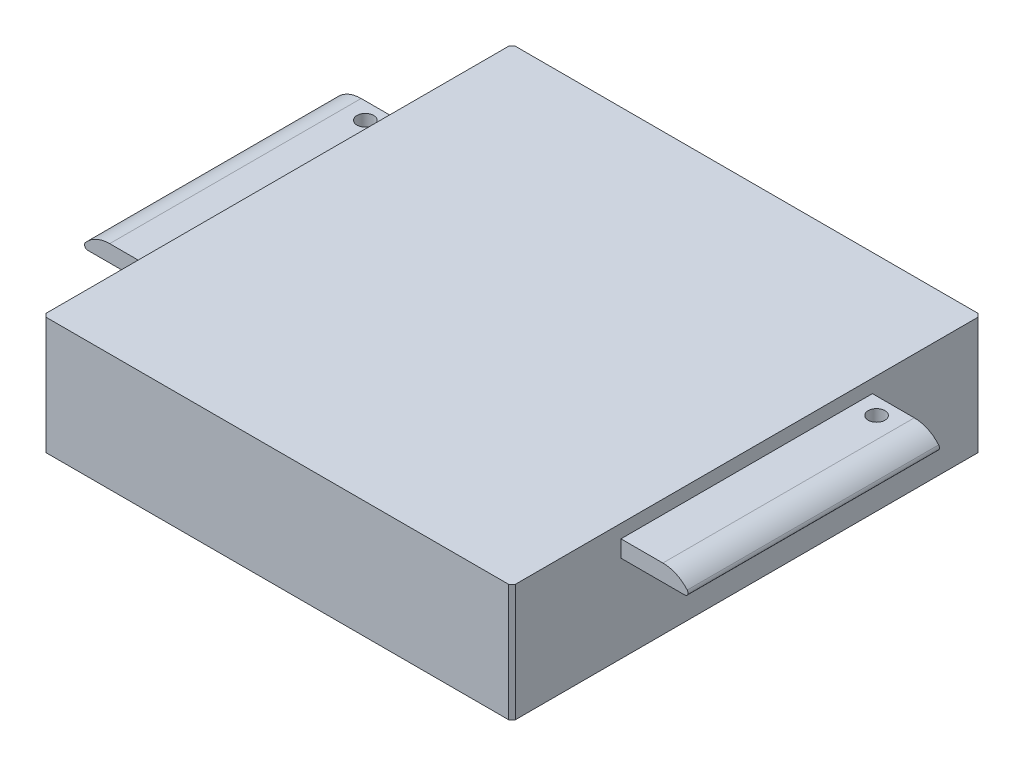
ISO-10303-21;
HEADER;
FILE_DESCRIPTION(('STEP AP214'),'2;1');
FILE_NAME('part.step','',(''),(''),'','','');
FILE_SCHEMA(('AUTOMOTIVE_DESIGN { 1 0 10303 214 1 1 1 1 }'));
ENDSEC;
DATA;
#1=APPLICATION_CONTEXT('core data for automotive mechanical design processes');
#2=APPLICATION_PROTOCOL_DEFINITION('international standard','automotive_design',2000,#1);
#3=PRODUCT_CONTEXT('',#1,'mechanical');
#4=PRODUCT('Part','Part','',(#3));
#5=PRODUCT_RELATED_PRODUCT_CATEGORY('part','',(#4));
#6=PRODUCT_DEFINITION_FORMATION('','',#4);
#7=PRODUCT_DEFINITION_CONTEXT('part definition',#1,'design');
#8=PRODUCT_DEFINITION('design','',#6,#7);
#9=PRODUCT_DEFINITION_SHAPE('','',#8);
#10=(LENGTH_UNIT() NAMED_UNIT(*) SI_UNIT(.MILLI.,.METRE.));
#11=(NAMED_UNIT(*) PLANE_ANGLE_UNIT() SI_UNIT($,.RADIAN.));
#12=(NAMED_UNIT(*) SI_UNIT($,.STERADIAN.) SOLID_ANGLE_UNIT());
#13=UNCERTAINTY_MEASURE_WITH_UNIT(LENGTH_MEASURE(1.E-05),#10,'distance_accuracy_value','');
#14=(GEOMETRIC_REPRESENTATION_CONTEXT(3) GLOBAL_UNCERTAINTY_ASSIGNED_CONTEXT((#13)) GLOBAL_UNIT_ASSIGNED_CONTEXT((#10,
#11,#12)) REPRESENTATION_CONTEXT('',''));
#15=CARTESIAN_POINT('',(0.,0.,0.));
#16=DIRECTION('',(0.,0.,1.));
#17=DIRECTION('',(1.,0.,0.));
#18=AXIS2_PLACEMENT_3D('',#15,#16,#17);
#19=CARTESIAN_POINT('',(139.584820323788,940.,-1063.));
#20=DIRECTION('',(1.,0.,0.));
#21=DIRECTION('',(0.,0.,-1.));
#22=AXIS2_PLACEMENT_3D('',#19,#20,#21);
#23=PLANE('',#22);
#24=DIRECTION('',(0.,0.,1.));
#25=VECTOR('',#24,1.);
#26=CARTESIAN_POINT('',(139.584820323788,870.,-1063.));
#27=LINE('',#26,#25);
#28=CARTESIAN_POINT('',(139.584820323788,870.,-1063.));
#29=VERTEX_POINT('',#28);
#30=CARTESIAN_POINT('',(139.584820323788,870.,-787.));
#31=VERTEX_POINT('',#30);
#32=EDGE_CURVE('E235',#29,#31,#27,.T.);
#33=ORIENTED_EDGE('',*,*,#32,.F.);
#34=DIRECTION('',(0.,-1.,0.));
#35=VECTOR('',#34,1.);
#36=CARTESIAN_POINT('',(139.584820323788,940.,-1063.));
#37=LINE('',#36,#35);
#38=CARTESIAN_POINT('',(139.584820323788,940.,-1063.));
#39=VERTEX_POINT('',#38);
#40=EDGE_CURVE('E11',#39,#29,#37,.T.);
#41=ORIENTED_EDGE('',*,*,#40,.F.);
#42=DIRECTION('',(0.,0.,1.));
#43=VECTOR('',#42,1.);
#44=CARTESIAN_POINT('',(139.584820323788,940.,-1063.));
#45=LINE('',#44,#43);
#46=CARTESIAN_POINT('',(139.584820323788,940.,-787.));
#47=VERTEX_POINT('',#46);
#48=EDGE_CURVE('E259',#39,#47,#45,.T.);
#49=ORIENTED_EDGE('',*,*,#48,.T.);
#50=DIRECTION('',(0.,-1.,0.));
#51=VECTOR('',#50,1.);
#52=CARTESIAN_POINT('',(139.584820323788,940.,-787.));
#53=LINE('',#52,#51);
#54=EDGE_CURVE('E25',#47,#31,#53,.T.);
#55=ORIENTED_EDGE('',*,*,#54,.T.);
#56=EDGE_LOOP('',(#33,#41,#49,#55));
#57=FACE_BOUND('',#56,.T.);
#58=DIRECTION('',(0.,0.,1.));
#59=VECTOR('',#58,1.);
#60=CARTESIAN_POINT('',(139.584820323788,932.,-1000.));
#61=LINE('',#60,#59);
#62=CARTESIAN_POINT('',(139.584820323788,932.,-1000.));
#63=VERTEX_POINT('',#62);
#64=CARTESIAN_POINT('',(139.584820323788,932.,-850.));
#65=VERTEX_POINT('',#64);
#66=EDGE_CURVE('E32',#63,#65,#61,.T.);
#67=ORIENTED_EDGE('',*,*,#66,.F.);
#68=DIRECTION('',(0.,-1.,0.));
#69=VECTOR('',#68,1.);
#70=CARTESIAN_POINT('',(139.584820323788,932.,-1000.));
#71=LINE('',#70,#69);
#72=CARTESIAN_POINT('',(139.584820323788,922.,-1000.));
#73=VERTEX_POINT('',#72);
#74=EDGE_CURVE('E36',#63,#73,#71,.T.);
#75=ORIENTED_EDGE('',*,*,#74,.T.);
#76=DIRECTION('',(0.,0.,1.));
#77=VECTOR('',#76,1.);
#78=CARTESIAN_POINT('',(139.584820323788,922.,-1000.));
#79=LINE('',#78,#77);
#80=CARTESIAN_POINT('',(139.584820323788,922.,-850.));
#81=VERTEX_POINT('',#80);
#82=EDGE_CURVE('E136',#73,#81,#79,.T.);
#83=ORIENTED_EDGE('',*,*,#82,.T.);
#84=DIRECTION('',(0.,-1.,0.));
#85=VECTOR('',#84,1.);
#86=CARTESIAN_POINT('',(139.584820323788,932.,-850.));
#87=LINE('',#86,#85);
#88=EDGE_CURVE('E139',#65,#81,#87,.T.);
#89=ORIENTED_EDGE('',*,*,#88,.F.);
#90=EDGE_LOOP('',(#67,#75,#83,#89));
#91=FACE_BOUND('',#90,.T.);
#92=ADVANCED_FACE('F17',(#57,#91),#23,.T.);
#93=CARTESIAN_POINT('',(137.584820323788,940.,-1065.));
#94=DIRECTION('',(0.707106781186548,0.,-0.707106781186548));
#95=DIRECTION('',(-0.707106781186548,0.,-0.707106781186548));
#96=AXIS2_PLACEMENT_3D('',#93,#94,#95);
#97=PLANE('',#96);
#98=DIRECTION('',(0.707106781186548,0.,0.707106781186548));
#99=VECTOR('',#98,1.);
#100=CARTESIAN_POINT('',(137.584820323788,870.,-1065.));
#101=LINE('',#100,#99);
#102=CARTESIAN_POINT('',(137.584820323788,870.,-1065.));
#103=VERTEX_POINT('',#102);
#104=EDGE_CURVE('E232',#103,#29,#101,.T.);
#105=ORIENTED_EDGE('',*,*,#104,.F.);
#106=DIRECTION('',(0.,-1.,0.));
#107=VECTOR('',#106,1.);
#108=CARTESIAN_POINT('',(137.584820323788,940.,-1065.));
#109=LINE('',#108,#107);
#110=CARTESIAN_POINT('',(137.584820323788,940.,-1065.));
#111=VERTEX_POINT('',#110);
#112=EDGE_CURVE('E280',#111,#103,#109,.T.);
#113=ORIENTED_EDGE('',*,*,#112,.F.);
#114=DIRECTION('',(0.707106781186548,0.,0.707106781186548));
#115=VECTOR('',#114,1.);
#116=CARTESIAN_POINT('',(137.584820323788,940.,-1065.));
#117=LINE('',#116,#115);
#118=EDGE_CURVE('E256',#111,#39,#117,.T.);
#119=ORIENTED_EDGE('',*,*,#118,.T.);
#120=ORIENTED_EDGE('',*,*,#40,.T.);
#121=EDGE_LOOP('',(#105,#113,#119,#120));
#122=FACE_BOUND('',#121,.T.);
#123=ADVANCED_FACE('F19',(#122),#97,.T.);
#124=CARTESIAN_POINT('',(139.584820323788,940.,-787.));
#125=DIRECTION('',(0.707106781186548,0.,0.707106781186548));
#126=DIRECTION('',(0.707106781186548,0.,-0.707106781186548));
#127=AXIS2_PLACEMENT_3D('',#124,#125,#126);
#128=PLANE('',#127);
#129=DIRECTION('',(-0.707106781186547,0.,0.707106781186548));
#130=VECTOR('',#129,1.);
#131=CARTESIAN_POINT('',(139.584820323788,870.,-787.));
#132=LINE('',#131,#130);
#133=CARTESIAN_POINT('',(137.584820323788,870.,-785.));
#134=VERTEX_POINT('',#133);
#135=EDGE_CURVE('E238',#31,#134,#132,.T.);
#136=ORIENTED_EDGE('',*,*,#135,.F.);
#137=ORIENTED_EDGE('',*,*,#54,.F.);
#138=DIRECTION('',(-0.707106781186547,0.,0.707106781186548));
#139=VECTOR('',#138,1.);
#140=CARTESIAN_POINT('',(139.584820323788,940.,-787.));
#141=LINE('',#140,#139);
#142=CARTESIAN_POINT('',(137.584820323788,940.,-785.));
#143=VERTEX_POINT('',#142);
#144=EDGE_CURVE('E262',#47,#143,#141,.T.);
#145=ORIENTED_EDGE('',*,*,#144,.T.);
#146=DIRECTION('',(0.,-1.,0.));
#147=VECTOR('',#146,1.);
#148=CARTESIAN_POINT('',(137.584820323788,940.,-785.));
#149=LINE('',#148,#147);
#150=EDGE_CURVE('E292',#143,#134,#149,.T.);
#151=ORIENTED_EDGE('',*,*,#150,.T.);
#152=EDGE_LOOP('',(#136,#137,#145,#151));
#153=FACE_BOUND('',#152,.T.);
#154=ADVANCED_FACE('F299',(#153),#128,.T.);
#155=CARTESIAN_POINT('',(137.584820323788,940.,-785.));
#156=DIRECTION('',(0.,0.,1.));
#157=DIRECTION('',(1.,0.,0.));
#158=AXIS2_PLACEMENT_3D('',#155,#156,#157);
#159=PLANE('',#158);
#160=DIRECTION('',(-1.,0.,0.));
#161=VECTOR('',#160,1.);
#162=CARTESIAN_POINT('',(137.584820323788,870.,-785.));
#163=LINE('',#162,#161);
#164=CARTESIAN_POINT('',(-138.415179676211,870.,-785.));
#165=VERTEX_POINT('',#164);
#166=EDGE_CURVE('E241',#134,#165,#163,.T.);
#167=ORIENTED_EDGE('',*,*,#166,.F.);
#168=ORIENTED_EDGE('',*,*,#150,.F.);
#169=DIRECTION('',(-1.,0.,0.));
#170=VECTOR('',#169,1.);
#171=CARTESIAN_POINT('',(137.584820323788,940.,-785.));
#172=LINE('',#171,#170);
#173=CARTESIAN_POINT('',(-138.415179676211,940.,-785.));
#174=VERTEX_POINT('',#173);
#175=EDGE_CURVE('E265',#143,#174,#172,.T.);
#176=ORIENTED_EDGE('',*,*,#175,.T.);
#177=DIRECTION('',(0.,-1.,0.));
#178=VECTOR('',#177,1.);
#179=CARTESIAN_POINT('',(-138.415179676211,940.,-785.));
#180=LINE('',#179,#178);
#181=EDGE_CURVE('E290',#174,#165,#180,.T.);
#182=ORIENTED_EDGE('',*,*,#181,.T.);
#183=EDGE_LOOP('',(#167,#168,#176,#182));
#184=FACE_BOUND('',#183,.T.);
#185=ADVANCED_FACE('F314',(#184),#159,.T.);
#186=CARTESIAN_POINT('',(-138.415179676211,940.,-785.));
#187=DIRECTION('',(-0.707106781186548,0.,0.707106781186548));
#188=DIRECTION('',(0.707106781186548,0.,0.707106781186548));
#189=AXIS2_PLACEMENT_3D('',#186,#187,#188);
#190=PLANE('',#189);
#191=DIRECTION('',(-0.707106781186548,0.,-0.707106781186548));
#192=VECTOR('',#191,1.);
#193=CARTESIAN_POINT('',(-138.415179676211,870.,-785.));
#194=LINE('',#193,#192);
#195=CARTESIAN_POINT('',(-140.415179676212,870.,-787.));
#196=VERTEX_POINT('',#195);
#197=EDGE_CURVE('E244',#165,#196,#194,.T.);
#198=ORIENTED_EDGE('',*,*,#197,.F.);
#199=ORIENTED_EDGE('',*,*,#181,.F.);
#200=DIRECTION('',(-0.707106781186548,0.,-0.707106781186548));
#201=VECTOR('',#200,1.);
#202=CARTESIAN_POINT('',(-138.415179676211,940.,-785.));
#203=LINE('',#202,#201);
#204=CARTESIAN_POINT('',(-140.415179676212,940.,-787.));
#205=VERTEX_POINT('',#204);
#206=EDGE_CURVE('E268',#174,#205,#203,.T.);
#207=ORIENTED_EDGE('',*,*,#206,.T.);
#208=DIRECTION('',(0.,-1.,0.));
#209=VECTOR('',#208,1.);
#210=CARTESIAN_POINT('',(-140.415179676212,940.,-787.));
#211=LINE('',#210,#209);
#212=EDGE_CURVE('E288',#205,#196,#211,.T.);
#213=ORIENTED_EDGE('',*,*,#212,.T.);
#214=EDGE_LOOP('',(#198,#199,#207,#213));
#215=FACE_BOUND('',#214,.T.);
#216=ADVANCED_FACE('F318',(#215),#190,.T.);
#217=CARTESIAN_POINT('',(-140.415179676212,940.,-787.));
#218=DIRECTION('',(-1.,0.,0.));
#219=DIRECTION('',(0.,0.,1.));
#220=AXIS2_PLACEMENT_3D('',#217,#218,#219);
#221=PLANE('',#220);
#222=DIRECTION('',(0.,-1.,0.));
#223=VECTOR('',#222,1.);
#224=CARTESIAN_POINT('',(-140.415179676212,932.,-1000.));
#225=LINE('',#224,#223);
#226=CARTESIAN_POINT('',(-140.415179676212,932.,-1000.));
#227=VERTEX_POINT('',#226);
#228=CARTESIAN_POINT('',(-140.415179676212,922.,-1000.));
#229=VERTEX_POINT('',#228);
#230=EDGE_CURVE('E205',#227,#229,#225,.T.);
#231=ORIENTED_EDGE('',*,*,#230,.F.);
#232=DIRECTION('',(0.,0.,1.));
#233=VECTOR('',#232,1.);
#234=CARTESIAN_POINT('',(-140.415179676212,932.,-1000.));
#235=LINE('',#234,#233);
#236=CARTESIAN_POINT('',(-140.415179676212,932.,-850.));
#237=VERTEX_POINT('',#236);
#238=EDGE_CURVE('E230',#227,#237,#235,.T.);
#239=ORIENTED_EDGE('',*,*,#238,.T.);
#240=DIRECTION('',(0.,-1.,0.));
#241=VECTOR('',#240,1.);
#242=CARTESIAN_POINT('',(-140.415179676212,932.,-850.));
#243=LINE('',#242,#241);
#244=CARTESIAN_POINT('',(-140.415179676212,922.,-850.));
#245=VERTEX_POINT('',#244);
#246=EDGE_CURVE('E191',#237,#245,#243,.T.);
#247=ORIENTED_EDGE('',*,*,#246,.T.);
#248=DIRECTION('',(0.,0.,1.));
#249=VECTOR('',#248,1.);
#250=CARTESIAN_POINT('',(-140.415179676212,922.,-1000.));
#251=LINE('',#250,#249);
#252=EDGE_CURVE('E227',#229,#245,#251,.T.);
#253=ORIENTED_EDGE('',*,*,#252,.F.);
#254=EDGE_LOOP('',(#231,#239,#247,#253));
#255=FACE_BOUND('',#254,.T.);
#256=DIRECTION('',(0.,0.,-1.));
#257=VECTOR('',#256,1.);
#258=CARTESIAN_POINT('',(-140.415179676212,870.,-787.));
#259=LINE('',#258,#257);
#260=CARTESIAN_POINT('',(-140.415179676212,870.,-1063.));
#261=VERTEX_POINT('',#260);
#262=EDGE_CURVE('E247',#196,#261,#259,.T.);
#263=ORIENTED_EDGE('',*,*,#262,.F.);
#264=ORIENTED_EDGE('',*,*,#212,.F.);
#265=DIRECTION('',(0.,0.,-1.));
#266=VECTOR('',#265,1.);
#267=CARTESIAN_POINT('',(-140.415179676212,940.,-787.));
#268=LINE('',#267,#266);
#269=CARTESIAN_POINT('',(-140.415179676212,940.,-1063.));
#270=VERTEX_POINT('',#269);
#271=EDGE_CURVE('E271',#205,#270,#268,.T.);
#272=ORIENTED_EDGE('',*,*,#271,.T.);
#273=DIRECTION('',(0.,-1.,0.));
#274=VECTOR('',#273,1.);
#275=CARTESIAN_POINT('',(-140.415179676212,940.,-1063.));
#276=LINE('',#275,#274);
#277=EDGE_CURVE('E286',#270,#261,#276,.T.);
#278=ORIENTED_EDGE('',*,*,#277,.T.);
#279=EDGE_LOOP('',(#263,#264,#272,#278));
#280=FACE_BOUND('',#279,.T.);
#281=ADVANCED_FACE('F320',(#255,#280),#221,.T.);
#282=CARTESIAN_POINT('',(-140.415179676211,940.,-1063.));
#283=DIRECTION('',(-0.707106781186548,0.,-0.707106781186548));
#284=DIRECTION('',(-0.707106781186548,0.,0.707106781186548));
#285=AXIS2_PLACEMENT_3D('',#282,#283,#284);
#286=PLANE('',#285);
#287=DIRECTION('',(0.707106781186548,0.,-0.707106781186548));
#288=VECTOR('',#287,1.);
#289=CARTESIAN_POINT('',(-140.415179676211,870.,-1063.));
#290=LINE('',#289,#288);
#291=CARTESIAN_POINT('',(-138.415179676212,870.,-1065.));
#292=VERTEX_POINT('',#291);
#293=EDGE_CURVE('E250',#261,#292,#290,.T.);
#294=ORIENTED_EDGE('',*,*,#293,.F.);
#295=ORIENTED_EDGE('',*,*,#277,.F.);
#296=DIRECTION('',(0.707106781186548,0.,-0.707106781186548));
#297=VECTOR('',#296,1.);
#298=CARTESIAN_POINT('',(-140.415179676211,940.,-1063.));
#299=LINE('',#298,#297);
#300=CARTESIAN_POINT('',(-138.415179676212,940.,-1065.));
#301=VERTEX_POINT('',#300);
#302=EDGE_CURVE('E274',#270,#301,#299,.T.);
#303=ORIENTED_EDGE('',*,*,#302,.T.);
#304=DIRECTION('',(0.,-1.,0.));
#305=VECTOR('',#304,1.);
#306=CARTESIAN_POINT('',(-138.415179676212,940.,-1065.));
#307=LINE('',#306,#305);
#308=EDGE_CURVE('E284',#301,#292,#307,.T.);
#309=ORIENTED_EDGE('',*,*,#308,.T.);
#310=EDGE_LOOP('',(#294,#295,#303,#309));
#311=FACE_BOUND('',#310,.T.);
#312=ADVANCED_FACE('F324',(#311),#286,.T.);
#313=CARTESIAN_POINT('',(-138.415179676212,940.,-1065.));
#314=DIRECTION('',(0.,0.,-1.));
#315=DIRECTION('',(-1.,0.,0.));
#316=AXIS2_PLACEMENT_3D('',#313,#314,#315);
#317=PLANE('',#316);
#318=DIRECTION('',(1.,0.,0.));
#319=VECTOR('',#318,1.);
#320=CARTESIAN_POINT('',(-138.415179676212,870.,-1065.));
#321=LINE('',#320,#319);
#322=EDGE_CURVE('E253',#292,#103,#321,.T.);
#323=ORIENTED_EDGE('',*,*,#322,.F.);
#324=ORIENTED_EDGE('',*,*,#308,.F.);
#325=DIRECTION('',(1.,0.,0.));
#326=VECTOR('',#325,1.);
#327=CARTESIAN_POINT('',(-138.415179676212,940.,-1065.));
#328=LINE('',#327,#326);
#329=EDGE_CURVE('E277',#301,#111,#328,.T.);
#330=ORIENTED_EDGE('',*,*,#329,.T.);
#331=ORIENTED_EDGE('',*,*,#112,.T.);
#332=EDGE_LOOP('',(#323,#324,#330,#331));
#333=FACE_BOUND('',#332,.T.);
#334=ADVANCED_FACE('F326',(#333),#317,.T.);
#335=CARTESIAN_POINT('',(277.584820323789,940.,-925.));
#336=DIRECTION('',(0.,-1.,0.));
#337=DIRECTION('',(1.,0.,0.));
#338=AXIS2_PLACEMENT_3D('',#335,#336,#337);
#339=PLANE('',#338);
#340=ORIENTED_EDGE('',*,*,#118,.F.);
#341=ORIENTED_EDGE('',*,*,#329,.F.);
#342=ORIENTED_EDGE('',*,*,#302,.F.);
#343=ORIENTED_EDGE('',*,*,#271,.F.);
#344=ORIENTED_EDGE('',*,*,#206,.F.);
#345=ORIENTED_EDGE('',*,*,#175,.F.);
#346=ORIENTED_EDGE('',*,*,#144,.F.);
#347=ORIENTED_EDGE('',*,*,#48,.F.);
#348=EDGE_LOOP('',(#340,#341,#342,#343,#344,#345,#346,#347));
#349=FACE_BOUND('',#348,.T.);
#350=ADVANCED_FACE('F308',(#349),#339,.F.);
#351=CARTESIAN_POINT('',(277.584820323789,870.,-925.));
#352=DIRECTION('',(0.,-1.,0.));
#353=DIRECTION('',(1.,0.,0.));
#354=AXIS2_PLACEMENT_3D('',#351,#352,#353);
#355=PLANE('',#354);
#356=ORIENTED_EDGE('',*,*,#104,.T.);
#357=ORIENTED_EDGE('',*,*,#32,.T.);
#358=ORIENTED_EDGE('',*,*,#135,.T.);
#359=ORIENTED_EDGE('',*,*,#166,.T.);
#360=ORIENTED_EDGE('',*,*,#197,.T.);
#361=ORIENTED_EDGE('',*,*,#262,.T.);
#362=ORIENTED_EDGE('',*,*,#293,.T.);
#363=ORIENTED_EDGE('',*,*,#322,.T.);
#364=EDGE_LOOP('',(#356,#357,#358,#359,#360,#361,#362,#363));
#365=FACE_BOUND('',#364,.T.);
#366=ADVANCED_FACE('F302',(#365),#355,.T.);
#367=CARTESIAN_POINT('',(-165.415179676209,932.,-1000.));
#368=DIRECTION('',(0.,1.,0.));
#369=DIRECTION('',(-1.,0.,0.));
#370=AXIS2_PLACEMENT_3D('',#367,#368,#369);
#371=PLANE('',#370);
#372=CARTESIAN_POINT('',(-152.915179676212,932.,-990.));
#373=DIRECTION('',(0.,1.,0.));
#374=DIRECTION('',(-1.,0.,0.));
#375=AXIS2_PLACEMENT_3D('',#372,#373,#374);
#376=CIRCLE('',#375,5.);
#377=CARTESIAN_POINT('',(-157.915179676212,932.,-990.));
#378=VERTEX_POINT('',#377);
#379=EDGE_CURVE('E185',#378,#378,#376,.T.);
#380=ORIENTED_EDGE('',*,*,#379,.F.);
#381=EDGE_LOOP('',(#380));
#382=FACE_BOUND('',#381,.T.);
#383=DIRECTION('',(1.,0.,0.));
#384=VECTOR('',#383,1.);
#385=CARTESIAN_POINT('',(-165.415179676209,932.,-850.));
#386=LINE('',#385,#384);
#387=CARTESIAN_POINT('',(-165.415179676209,932.,-850.));
#388=VERTEX_POINT('',#387);
#389=EDGE_CURVE('E194',#388,#237,#386,.T.);
#390=ORIENTED_EDGE('',*,*,#389,.T.);
#391=ORIENTED_EDGE('',*,*,#238,.F.);
#392=DIRECTION('',(1.,0.,0.));
#393=VECTOR('',#392,1.);
#394=CARTESIAN_POINT('',(-165.415179676209,932.,-1000.));
#395=LINE('',#394,#393);
#396=CARTESIAN_POINT('',(-165.415179676209,932.,-1000.));
#397=VERTEX_POINT('',#396);
#398=EDGE_CURVE('E202',#397,#227,#395,.T.);
#399=ORIENTED_EDGE('',*,*,#398,.F.);
#400=DIRECTION('',(0.,0.,1.));
#401=VECTOR('',#400,1.);
#402=CARTESIAN_POINT('',(-165.415179676209,932.,-1000.));
#403=LINE('',#402,#401);
#404=EDGE_CURVE('E216',#397,#388,#403,.T.);
#405=ORIENTED_EDGE('',*,*,#404,.T.);
#406=EDGE_LOOP('',(#390,#391,#399,#405));
#407=FACE_BOUND('',#406,.T.);
#408=ADVANCED_FACE('F359',(#382,#407),#371,.T.);
#409=CARTESIAN_POINT('',(-140.415179676212,922.,-1000.));
#410=DIRECTION('',(0.,-1.,0.));
#411=DIRECTION('',(1.,0.,0.));
#412=AXIS2_PLACEMENT_3D('',#409,#410,#411);
#413=PLANE('',#412);
#414=CARTESIAN_POINT('',(-152.915179676212,922.,-990.));
#415=DIRECTION('',(0.,1.,0.));
#416=DIRECTION('',(1.,0.,0.));
#417=AXIS2_PLACEMENT_3D('',#414,#415,#416);
#418=CIRCLE('',#417,5.);
#419=CARTESIAN_POINT('',(-147.915179676212,922.,-990.));
#420=VERTEX_POINT('',#419);
#421=EDGE_CURVE('E190',#420,#420,#418,.T.);
#422=ORIENTED_EDGE('',*,*,#421,.T.);
#423=EDGE_LOOP('',(#422));
#424=FACE_BOUND('',#423,.T.);
#425=DIRECTION('',(-1.,0.,0.));
#426=VECTOR('',#425,1.);
#427=CARTESIAN_POINT('',(-140.415179676212,922.,-850.));
#428=LINE('',#427,#426);
#429=CARTESIAN_POINT('',(-178.415179676212,922.,-850.));
#430=VERTEX_POINT('',#429);
#431=EDGE_CURVE('E193',#245,#430,#428,.T.);
#432=ORIENTED_EDGE('',*,*,#431,.T.);
#433=DIRECTION('',(0.,0.,1.));
#434=VECTOR('',#433,1.);
#435=CARTESIAN_POINT('',(-178.415179676212,922.,-1000.));
#436=LINE('',#435,#434);
#437=CARTESIAN_POINT('',(-178.415179676212,922.,-1000.));
#438=VERTEX_POINT('',#437);
#439=EDGE_CURVE('E224',#438,#430,#436,.T.);
#440=ORIENTED_EDGE('',*,*,#439,.F.);
#441=DIRECTION('',(-1.,0.,0.));
#442=VECTOR('',#441,1.);
#443=CARTESIAN_POINT('',(-140.415179676212,922.,-1000.));
#444=LINE('',#443,#442);
#445=EDGE_CURVE('E208',#229,#438,#444,.T.);
#446=ORIENTED_EDGE('',*,*,#445,.F.);
#447=ORIENTED_EDGE('',*,*,#252,.T.);
#448=EDGE_LOOP('',(#432,#440,#446,#447));
#449=FACE_BOUND('',#448,.T.);
#450=ADVANCED_FACE('F366',(#424,#449),#413,.T.);
#451=CARTESIAN_POINT('',(-178.415179676212,924.,-1000.));
#452=DIRECTION('',(0.,0.,1.));
#453=DIRECTION('',(1.,0.,0.));
#454=AXIS2_PLACEMENT_3D('',#451,#452,#453);
#455=CYLINDRICAL_SURFACE('',#454,2.);
#456=CARTESIAN_POINT('',(-178.415179676212,924.,-850.));
#457=DIRECTION('',(0.,0.,-1.));
#458=DIRECTION('',(0.,-1.,0.));
#459=AXIS2_PLACEMENT_3D('',#456,#457,#458);
#460=CIRCLE('',#459,2.);
#461=CARTESIAN_POINT('',(-179.940063732155,925.294113061495,-850.));
#462=VERTEX_POINT('',#461);
#463=EDGE_CURVE('E197',#430,#462,#460,.T.);
#464=ORIENTED_EDGE('',*,*,#463,.T.);
#465=DIRECTION('',(0.,0.,1.));
#466=VECTOR('',#465,1.);
#467=CARTESIAN_POINT('',(-179.940063732154,925.294113061495,-1000.));
#468=LINE('',#467,#466);
#469=CARTESIAN_POINT('',(-179.940063732154,925.294113061495,-1000.));
#470=VERTEX_POINT('',#469);
#471=EDGE_CURVE('E221',#470,#462,#468,.T.);
#472=ORIENTED_EDGE('',*,*,#471,.F.);
#473=CARTESIAN_POINT('',(-178.415179676212,924.,-1000.));
#474=DIRECTION('',(0.,0.,-1.));
#475=DIRECTION('',(0.,-1.,0.));
#476=AXIS2_PLACEMENT_3D('',#473,#474,#475);
#477=CIRCLE('',#476,2.);
#478=EDGE_CURVE('E211',#438,#470,#477,.T.);
#479=ORIENTED_EDGE('',*,*,#478,.F.);
#480=ORIENTED_EDGE('',*,*,#439,.T.);
#481=EDGE_LOOP('',(#464,#472,#479,#480));
#482=FACE_BOUND('',#481,.T.);
#483=ADVANCED_FACE('F369',(#482),#455,.T.);
#484=CARTESIAN_POINT('',(-165.453665200699,913.000038977292,-1000.));
#485=DIRECTION('',(0.,0.,1.));
#486=DIRECTION('',(1.,0.,0.));
#487=AXIS2_PLACEMENT_3D('',#484,#485,#486);
#488=CYLINDRICAL_SURFACE('',#487,19.);
#489=CARTESIAN_POINT('',(-165.453665200699,913.000038977292,-850.));
#490=DIRECTION('',(0.,0.,-1.));
#491=DIRECTION('',(0.00202555392040569,0.999997948563554,0.));
#492=AXIS2_PLACEMENT_3D('',#489,#490,#491);
#493=CIRCLE('',#492,19.);
#494=EDGE_CURVE('E200',#462,#388,#493,.T.);
#495=ORIENTED_EDGE('',*,*,#494,.T.);
#496=ORIENTED_EDGE('',*,*,#404,.F.);
#497=CARTESIAN_POINT('',(-165.453665200699,913.000038977292,-1000.));
#498=DIRECTION('',(0.,0.,-1.));
#499=DIRECTION('',(0.00202555392040569,0.999997948563554,0.));
#500=AXIS2_PLACEMENT_3D('',#497,#498,#499);
#501=CIRCLE('',#500,19.);
#502=EDGE_CURVE('E214',#470,#397,#501,.T.);
#503=ORIENTED_EDGE('',*,*,#502,.F.);
#504=ORIENTED_EDGE('',*,*,#471,.T.);
#505=EDGE_LOOP('',(#495,#496,#503,#504));
#506=FACE_BOUND('',#505,.T.);
#507=ADVANCED_FACE('F371',(#506),#488,.T.);
#508=CARTESIAN_POINT('',(-178.415179676212,924.,-1000.));
#509=DIRECTION('',(0.,0.,1.));
#510=DIRECTION('',(1.,0.,0.));
#511=AXIS2_PLACEMENT_3D('',#508,#509,#510);
#512=PLANE('',#511);
#513=ORIENTED_EDGE('',*,*,#398,.T.);
#514=ORIENTED_EDGE('',*,*,#230,.T.);
#515=ORIENTED_EDGE('',*,*,#445,.T.);
#516=ORIENTED_EDGE('',*,*,#478,.T.);
#517=ORIENTED_EDGE('',*,*,#502,.T.);
#518=EDGE_LOOP('',(#513,#514,#515,#516,#517));
#519=FACE_BOUND('',#518,.T.);
#520=ADVANCED_FACE('F356',(#519),#512,.F.);
#521=CARTESIAN_POINT('',(-178.415179676212,924.,-850.));
#522=DIRECTION('',(0.,0.,1.));
#523=DIRECTION('',(1.,0.,0.));
#524=AXIS2_PLACEMENT_3D('',#521,#522,#523);
#525=PLANE('',#524);
#526=ORIENTED_EDGE('',*,*,#389,.F.);
#527=ORIENTED_EDGE('',*,*,#494,.F.);
#528=ORIENTED_EDGE('',*,*,#463,.F.);
#529=ORIENTED_EDGE('',*,*,#431,.F.);
#530=ORIENTED_EDGE('',*,*,#246,.F.);
#531=EDGE_LOOP('',(#526,#527,#528,#529,#530));
#532=FACE_BOUND('',#531,.T.);
#533=ADVANCED_FACE('F362',(#532),#525,.T.);
#534=CARTESIAN_POINT('',(-152.915179676212,916.999999999951,-990.));
#535=DIRECTION('',(0.,1.,0.));
#536=DIRECTION('',(-1.,0.,0.));
#537=AXIS2_PLACEMENT_3D('',#534,#535,#536);
#538=CYLINDRICAL_SURFACE('',#537,5.);
#539=ORIENTED_EDGE('',*,*,#421,.F.);
#540=EDGE_LOOP('',(#539));
#541=FACE_BOUND('',#540,.T.);
#542=ORIENTED_EDGE('',*,*,#379,.T.);
#543=EDGE_LOOP('',(#542));
#544=FACE_BOUND('',#543,.T.);
#545=ADVANCED_FACE('F434',(#541,#544),#538,.F.);
#546=CARTESIAN_POINT('',(164.584820323786,932.,-1000.));
#547=DIRECTION('',(0.,1.,0.));
#548=DIRECTION('',(1.,0.,0.));
#549=AXIS2_PLACEMENT_3D('',#546,#547,#548);
#550=PLANE('',#549);
#551=CARTESIAN_POINT('',(152.084820323789,932.,-990.));
#552=DIRECTION('',(0.,-1.,0.));
#553=DIRECTION('',(1.,0.,0.));
#554=AXIS2_PLACEMENT_3D('',#551,#552,#553);
#555=CIRCLE('',#554,5.);
#556=CARTESIAN_POINT('',(157.084820323789,932.,-990.));
#557=VERTEX_POINT('',#556);
#558=EDGE_CURVE('E162',#557,#557,#555,.T.);
#559=ORIENTED_EDGE('',*,*,#558,.T.);
#560=EDGE_LOOP('',(#559));
#561=FACE_BOUND('',#560,.T.);
#562=DIRECTION('',(-1.,0.,0.));
#563=VECTOR('',#562,1.);
#564=CARTESIAN_POINT('',(164.584820323786,932.,-850.));
#565=LINE('',#564,#563);
#566=CARTESIAN_POINT('',(164.584820323786,932.,-850.));
#567=VERTEX_POINT('',#566);
#568=EDGE_CURVE('E157',#567,#65,#565,.T.);
#569=ORIENTED_EDGE('',*,*,#568,.F.);
#570=DIRECTION('',(0.,0.,1.));
#571=VECTOR('',#570,1.);
#572=CARTESIAN_POINT('',(164.584820323786,932.,-1000.));
#573=LINE('',#572,#571);
#574=CARTESIAN_POINT('',(164.584820323786,932.,-1000.));
#575=VERTEX_POINT('',#574);
#576=EDGE_CURVE('E177',#575,#567,#573,.T.);
#577=ORIENTED_EDGE('',*,*,#576,.F.);
#578=DIRECTION('',(-1.,0.,0.));
#579=VECTOR('',#578,1.);
#580=CARTESIAN_POINT('',(164.584820323786,932.,-1000.));
#581=LINE('',#580,#579);
#582=EDGE_CURVE('E166',#575,#63,#581,.T.);
#583=ORIENTED_EDGE('',*,*,#582,.T.);
#584=ORIENTED_EDGE('',*,*,#66,.T.);
#585=EDGE_LOOP('',(#569,#577,#583,#584));
#586=FACE_BOUND('',#585,.T.);
#587=ADVANCED_FACE('F442',(#561,#586),#550,.T.);
#588=CARTESIAN_POINT('',(139.584820323788,922.,-1000.));
#589=DIRECTION('',(0.,-1.,0.));
#590=DIRECTION('',(-1.,0.,0.));
#591=AXIS2_PLACEMENT_3D('',#588,#589,#590);
#592=PLANE('',#591);
#593=CARTESIAN_POINT('',(152.084820323789,922.,-990.));
#594=DIRECTION('',(0.,-1.,0.));
#595=DIRECTION('',(-1.,0.,0.));
#596=AXIS2_PLACEMENT_3D('',#593,#594,#595);
#597=CIRCLE('',#596,5.);
#598=CARTESIAN_POINT('',(147.084820323789,922.,-990.));
#599=VERTEX_POINT('',#598);
#600=EDGE_CURVE('E159',#599,#599,#597,.T.);
#601=ORIENTED_EDGE('',*,*,#600,.F.);
#602=EDGE_LOOP('',(#601));
#603=FACE_BOUND('',#602,.T.);
#604=DIRECTION('',(1.,0.,0.));
#605=VECTOR('',#604,1.);
#606=CARTESIAN_POINT('',(139.584820323788,922.,-850.));
#607=LINE('',#606,#605);
#608=CARTESIAN_POINT('',(177.584820323789,922.,-850.));
#609=VERTEX_POINT('',#608);
#610=EDGE_CURVE('E146',#81,#609,#607,.T.);
#611=ORIENTED_EDGE('',*,*,#610,.F.);
#612=ORIENTED_EDGE('',*,*,#82,.F.);
#613=DIRECTION('',(1.,0.,0.));
#614=VECTOR('',#613,1.);
#615=CARTESIAN_POINT('',(139.584820323788,922.,-1000.));
#616=LINE('',#615,#614);
#617=CARTESIAN_POINT('',(177.584820323789,922.,-1000.));
#618=VERTEX_POINT('',#617);
#619=EDGE_CURVE('E169',#73,#618,#616,.T.);
#620=ORIENTED_EDGE('',*,*,#619,.T.);
#621=DIRECTION('',(0.,0.,1.));
#622=VECTOR('',#621,1.);
#623=CARTESIAN_POINT('',(177.584820323789,922.,-1000.));
#624=LINE('',#623,#622);
#625=EDGE_CURVE('E143',#618,#609,#624,.T.);
#626=ORIENTED_EDGE('',*,*,#625,.T.);
#627=EDGE_LOOP('',(#611,#612,#620,#626));
#628=FACE_BOUND('',#627,.T.);
#629=ADVANCED_FACE('F147',(#603,#628),#592,.T.);
#630=CARTESIAN_POINT('',(177.584820323789,924.,-1000.));
#631=DIRECTION('',(0.,0.,1.));
#632=DIRECTION('',(-1.,0.,0.));
#633=AXIS2_PLACEMENT_3D('',#630,#631,#632);
#634=CYLINDRICAL_SURFACE('',#633,2.);
#635=CARTESIAN_POINT('',(177.584820323789,924.,-850.));
#636=DIRECTION('',(0.,0.,1.));
#637=DIRECTION('',(0.,-1.,0.));
#638=AXIS2_PLACEMENT_3D('',#635,#636,#637);
#639=CIRCLE('',#638,2.);
#640=CARTESIAN_POINT('',(179.109704379731,925.294113061495,-850.));
#641=VERTEX_POINT('',#640);
#642=EDGE_CURVE('E151',#609,#641,#639,.T.);
#643=ORIENTED_EDGE('',*,*,#642,.F.);
#644=ORIENTED_EDGE('',*,*,#625,.F.);
#645=CARTESIAN_POINT('',(177.584820323789,924.,-1000.));
#646=DIRECTION('',(0.,0.,1.));
#647=DIRECTION('',(0.,-1.,0.));
#648=AXIS2_PLACEMENT_3D('',#645,#646,#647);
#649=CIRCLE('',#648,2.);
#650=CARTESIAN_POINT('',(179.109704379731,925.294113061495,-1000.));
#651=VERTEX_POINT('',#650);
#652=EDGE_CURVE('E171',#618,#651,#649,.T.);
#653=ORIENTED_EDGE('',*,*,#652,.T.);
#654=DIRECTION('',(0.,0.,1.));
#655=VECTOR('',#654,1.);
#656=CARTESIAN_POINT('',(179.109704379731,925.294113061495,-1000.));
#657=LINE('',#656,#655);
#658=EDGE_CURVE('E181',#651,#641,#657,.T.);
#659=ORIENTED_EDGE('',*,*,#658,.T.);
#660=EDGE_LOOP('',(#643,#644,#653,#659));
#661=FACE_BOUND('',#660,.T.);
#662=ADVANCED_FACE('F461',(#661),#634,.T.);
#663=CARTESIAN_POINT('',(164.623305848276,913.000038977292,-1000.));
#664=DIRECTION('',(0.,0.,1.));
#665=DIRECTION('',(-1.,0.,0.));
#666=AXIS2_PLACEMENT_3D('',#663,#664,#665);
#667=CYLINDRICAL_SURFACE('',#666,19.);
#668=CARTESIAN_POINT('',(164.623305848276,913.000038977292,-850.));
#669=DIRECTION('',(0.,0.,1.));
#670=DIRECTION('',(-0.00202555392040569,0.999997948563554,0.));
#671=AXIS2_PLACEMENT_3D('',#668,#669,#670);
#672=CIRCLE('',#671,19.);
#673=EDGE_CURVE('E165',#641,#567,#672,.T.);
#674=ORIENTED_EDGE('',*,*,#673,.F.);
#675=ORIENTED_EDGE('',*,*,#658,.F.);
#676=CARTESIAN_POINT('',(164.623305848276,913.000038977292,-1000.));
#677=DIRECTION('',(0.,0.,1.));
#678=DIRECTION('',(-0.00202555392040569,0.999997948563554,0.));
#679=AXIS2_PLACEMENT_3D('',#676,#677,#678);
#680=CIRCLE('',#679,19.);
#681=EDGE_CURVE('E174',#651,#575,#680,.T.);
#682=ORIENTED_EDGE('',*,*,#681,.T.);
#683=ORIENTED_EDGE('',*,*,#576,.T.);
#684=EDGE_LOOP('',(#674,#675,#682,#683));
#685=FACE_BOUND('',#684,.T.);
#686=ADVANCED_FACE('F471',(#685),#667,.T.);
#687=CARTESIAN_POINT('',(177.584820323789,924.,-1000.));
#688=DIRECTION('',(0.,0.,1.));
#689=DIRECTION('',(-1.,0.,0.));
#690=AXIS2_PLACEMENT_3D('',#687,#688,#689);
#691=PLANE('',#690);
#692=ORIENTED_EDGE('',*,*,#582,.F.);
#693=ORIENTED_EDGE('',*,*,#681,.F.);
#694=ORIENTED_EDGE('',*,*,#652,.F.);
#695=ORIENTED_EDGE('',*,*,#619,.F.);
#696=ORIENTED_EDGE('',*,*,#74,.F.);
#697=EDGE_LOOP('',(#692,#693,#694,#695,#696));
#698=FACE_BOUND('',#697,.T.);
#699=ADVANCED_FACE('F481',(#698),#691,.F.);
#700=CARTESIAN_POINT('',(177.584820323789,924.,-850.));
#701=DIRECTION('',(0.,0.,1.));
#702=DIRECTION('',(-1.,0.,0.));
#703=AXIS2_PLACEMENT_3D('',#700,#701,#702);
#704=PLANE('',#703);
#705=ORIENTED_EDGE('',*,*,#568,.T.);
#706=ORIENTED_EDGE('',*,*,#88,.T.);
#707=ORIENTED_EDGE('',*,*,#610,.T.);
#708=ORIENTED_EDGE('',*,*,#642,.T.);
#709=ORIENTED_EDGE('',*,*,#673,.T.);
#710=EDGE_LOOP('',(#705,#706,#707,#708,#709));
#711=FACE_BOUND('',#710,.T.);
#712=ADVANCED_FACE('F154',(#711),#704,.T.);
#713=CARTESIAN_POINT('',(152.084820323789,916.999999999951,-990.));
#714=DIRECTION('',(0.,1.,0.));
#715=DIRECTION('',(1.,0.,0.));
#716=AXIS2_PLACEMENT_3D('',#713,#714,#715);
#717=CYLINDRICAL_SURFACE('',#716,5.);
#718=ORIENTED_EDGE('',*,*,#600,.T.);
#719=EDGE_LOOP('',(#718));
#720=FACE_BOUND('',#719,.T.);
#721=ORIENTED_EDGE('',*,*,#558,.F.);
#722=EDGE_LOOP('',(#721));
#723=FACE_BOUND('',#722,.T.);
#724=ADVANCED_FACE('F500',(#720,#723),#717,.F.);
#725=CLOSED_SHELL('',(#92,#123,#154,#185,#216,#281,#312,#334,#350,#366,#408,#450,#483,#507,#520,
#533,#545,#587,#629,#662,#686,#699,#712,#724));
#726=MANIFOLD_SOLID_BREP('B1',#725);
#727=ADVANCED_BREP_SHAPE_REPRESENTATION('',(#18,#726),#14);
#728=SHAPE_DEFINITION_REPRESENTATION(#9,#727);
ENDSEC;
END-ISO-10303-21;
